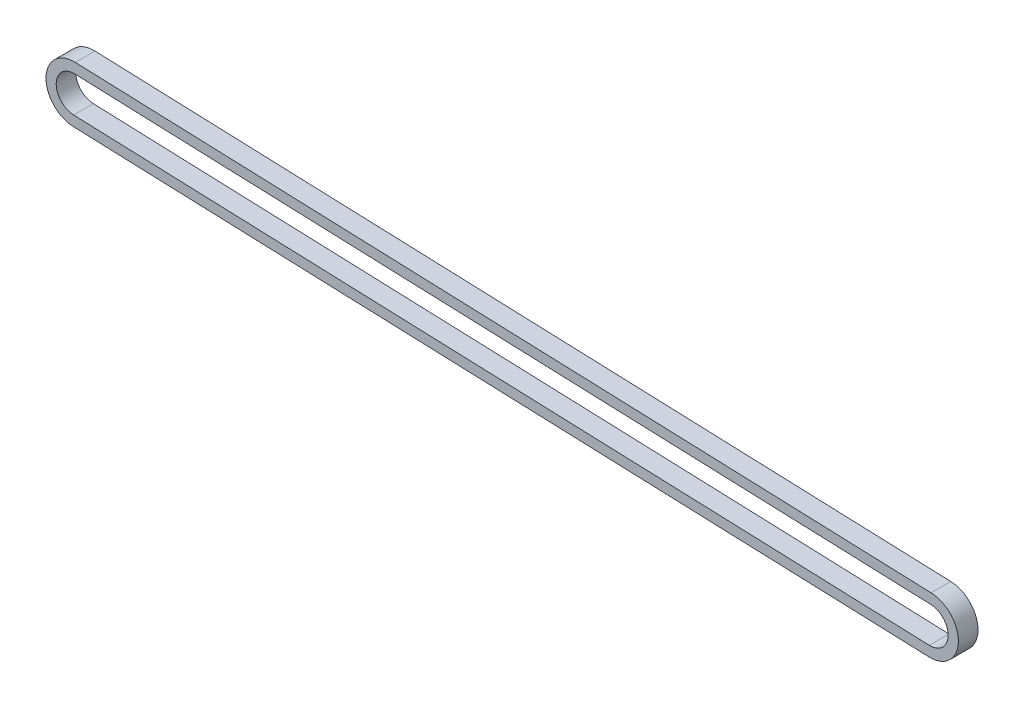
ISO-10303-21;
HEADER;
FILE_DESCRIPTION(('STEP AP214'),'2;1');
FILE_NAME('part.step','',(''),(''),'','','');
FILE_SCHEMA(('AUTOMOTIVE_DESIGN { 1 0 10303 214 1 1 1 1 }'));
ENDSEC;
DATA;
#1=APPLICATION_CONTEXT('core data for automotive mechanical design processes');
#2=APPLICATION_PROTOCOL_DEFINITION('international standard','automotive_design',2000,#1);
#3=PRODUCT_CONTEXT('',#1,'mechanical');
#4=PRODUCT('Part','Part','',(#3));
#5=PRODUCT_RELATED_PRODUCT_CATEGORY('part','',(#4));
#6=PRODUCT_DEFINITION_FORMATION('','',#4);
#7=PRODUCT_DEFINITION_CONTEXT('part definition',#1,'design');
#8=PRODUCT_DEFINITION('design','',#6,#7);
#9=PRODUCT_DEFINITION_SHAPE('','',#8);
#10=(LENGTH_UNIT() NAMED_UNIT(*) SI_UNIT(.MILLI.,.METRE.));
#11=(NAMED_UNIT(*) PLANE_ANGLE_UNIT() SI_UNIT($,.RADIAN.));
#12=(NAMED_UNIT(*) SI_UNIT($,.STERADIAN.) SOLID_ANGLE_UNIT());
#13=UNCERTAINTY_MEASURE_WITH_UNIT(LENGTH_MEASURE(1.E-05),#10,'distance_accuracy_value','');
#14=(GEOMETRIC_REPRESENTATION_CONTEXT(3) GLOBAL_UNCERTAINTY_ASSIGNED_CONTEXT((#13)) GLOBAL_UNIT_ASSIGNED_CONTEXT((#10,
#11,#12)) REPRESENTATION_CONTEXT('',''));
#15=CARTESIAN_POINT('',(0.,0.,0.));
#16=DIRECTION('',(0.,0.,1.));
#17=DIRECTION('',(1.,0.,0.));
#18=AXIS2_PLACEMENT_3D('',#15,#16,#17);
#19=CARTESIAN_POINT('',(0.,0.,3.175));
#20=DIRECTION('',(0.,0.,1.));
#21=DIRECTION('',(1.,0.,0.));
#22=AXIS2_PLACEMENT_3D('',#19,#20,#21);
#23=PLANE('',#22);
#24=CARTESIAN_POINT('',(0.,0.,3.175));
#25=DIRECTION('',(0.,0.,1.));
#26=DIRECTION('',(1.,0.,0.));
#27=AXIS2_PLACEMENT_3D('',#24,#25,#26);
#28=CIRCLE('',#27,4.572);
#29=CARTESIAN_POINT('',(-0.167974752628622,-4.56891327149896,3.175));
#30=VERTEX_POINT('',#29);
#31=CARTESIAN_POINT('',(0.167974752628638,4.56891327149896,3.175));
#32=VERTEX_POINT('',#31);
#33=EDGE_CURVE('E153',#30,#32,#28,.T.);
#34=ORIENTED_EDGE('',*,*,#33,.T.);
#35=DIRECTION('',(-0.999324862532581,0.0367398846519331,0.));
#36=VECTOR('',#35,1.);
#37=CARTESIAN_POINT('',(0.167974752628638,4.56891327149896,3.175));
#38=LINE('',#37,#36);
#39=CARTESIAN_POINT('',(-138.008025247371,9.64891327149896,3.175));
#40=VERTEX_POINT('',#39);
#41=EDGE_CURVE('E157',#32,#40,#38,.T.);
#42=ORIENTED_EDGE('',*,*,#41,.T.);
#43=CARTESIAN_POINT('',(-138.176,5.08,3.175));
#44=DIRECTION('',(0.,0.,1.));
#45=DIRECTION('',(1.,0.,0.));
#46=AXIS2_PLACEMENT_3D('',#43,#44,#45);
#47=CIRCLE('',#46,4.572);
#48=CARTESIAN_POINT('',(-138.343974752629,0.511086728501041,3.175));
#49=VERTEX_POINT('',#48);
#50=EDGE_CURVE('E161',#40,#49,#47,.T.);
#51=ORIENTED_EDGE('',*,*,#50,.T.);
#52=DIRECTION('',(0.999324862532581,-0.0367398846519331,0.));
#53=VECTOR('',#52,1.);
#54=CARTESIAN_POINT('',(-138.343974752629,0.51108672850104,3.175));
#55=LINE('',#54,#53);
#56=EDGE_CURVE('E164',#49,#30,#55,.T.);
#57=ORIENTED_EDGE('',*,*,#56,.T.);
#58=EDGE_LOOP('',(#34,#42,#51,#57));
#59=FACE_BOUND('',#58,.T.);
#60=DIRECTION('',(0.999324862532581,-0.0367398846519331,0.));
#61=VECTOR('',#60,1.);
#62=CARTESIAN_POINT('',(-138.283317203068,2.16097207654233,3.175));
#63=LINE('',#62,#61);
#64=CARTESIAN_POINT('',(-138.283317203068,2.16097207654233,3.175));
#65=VERTEX_POINT('',#64);
#66=CARTESIAN_POINT('',(-0.107317203068297,-2.91902792345767,3.175));
#67=VERTEX_POINT('',#66);
#68=EDGE_CURVE('E114',#65,#67,#63,.T.);
#69=ORIENTED_EDGE('',*,*,#68,.F.);
#70=CARTESIAN_POINT('',(-138.176,5.08,3.175));
#71=DIRECTION('',(0.,0.,1.));
#72=DIRECTION('',(1.,0.,0.));
#73=AXIS2_PLACEMENT_3D('',#70,#71,#72);
#74=CIRCLE('',#73,2.921);
#75=CARTESIAN_POINT('',(-138.068682796932,7.99902792345767,3.175));
#76=VERTEX_POINT('',#75);
#77=EDGE_CURVE('E105',#76,#65,#74,.T.);
#78=ORIENTED_EDGE('',*,*,#77,.F.);
#79=DIRECTION('',(-0.999324862532581,0.0367398846519331,0.));
#80=VECTOR('',#79,1.);
#81=CARTESIAN_POINT('',(0.107317203068297,2.91902792345767,3.175));
#82=LINE('',#81,#80);
#83=CARTESIAN_POINT('',(0.107317203068297,2.91902792345767,3.175));
#84=VERTEX_POINT('',#83);
#85=EDGE_CURVE('E131',#84,#76,#82,.T.);
#86=ORIENTED_EDGE('',*,*,#85,.F.);
#87=CARTESIAN_POINT('',(0.,0.,3.175));
#88=DIRECTION('',(0.,0.,1.));
#89=DIRECTION('',(1.,0.,0.));
#90=AXIS2_PLACEMENT_3D('',#87,#88,#89);
#91=CIRCLE('',#90,2.921);
#92=EDGE_CURVE('E127',#67,#84,#91,.T.);
#93=ORIENTED_EDGE('',*,*,#92,.F.);
#94=EDGE_LOOP('',(#69,#78,#86,#93));
#95=FACE_BOUND('',#94,.T.);
#96=ADVANCED_FACE('F39',(#59,#95),#23,.T.);
#97=CARTESIAN_POINT('',(0.,0.,0.));
#98=DIRECTION('',(0.,0.,1.));
#99=DIRECTION('',(1.,0.,0.));
#100=AXIS2_PLACEMENT_3D('',#97,#98,#99);
#101=PLANE('',#100);
#102=CARTESIAN_POINT('',(0.,0.,0.));
#103=DIRECTION('',(0.,0.,1.));
#104=DIRECTION('',(1.,0.,0.));
#105=AXIS2_PLACEMENT_3D('',#102,#103,#104);
#106=CIRCLE('',#105,4.572);
#107=CARTESIAN_POINT('',(-0.167974752628622,-4.56891327149896,0.));
#108=VERTEX_POINT('',#107);
#109=CARTESIAN_POINT('',(0.167974752628638,4.56891327149896,0.));
#110=VERTEX_POINT('',#109);
#111=EDGE_CURVE('E123',#108,#110,#106,.T.);
#112=ORIENTED_EDGE('',*,*,#111,.F.);
#113=DIRECTION('',(0.999324862532581,-0.0367398846519331,0.));
#114=VECTOR('',#113,1.);
#115=CARTESIAN_POINT('',(-138.343974752629,0.51108672850104,0.));
#116=LINE('',#115,#114);
#117=CARTESIAN_POINT('',(-138.343974752629,0.511086728501041,0.));
#118=VERTEX_POINT('',#117);
#119=EDGE_CURVE('E158',#118,#108,#116,.T.);
#120=ORIENTED_EDGE('',*,*,#119,.F.);
#121=CARTESIAN_POINT('',(-138.176,5.08,0.));
#122=DIRECTION('',(0.,0.,1.));
#123=DIRECTION('',(1.,0.,0.));
#124=AXIS2_PLACEMENT_3D('',#121,#122,#123);
#125=CIRCLE('',#124,4.572);
#126=CARTESIAN_POINT('',(-138.008025247371,9.64891327149896,0.));
#127=VERTEX_POINT('',#126);
#128=EDGE_CURVE('E174',#127,#118,#125,.T.);
#129=ORIENTED_EDGE('',*,*,#128,.F.);
#130=DIRECTION('',(-0.999324862532581,0.0367398846519331,0.));
#131=VECTOR('',#130,1.);
#132=CARTESIAN_POINT('',(0.167974752628638,4.56891327149896,0.));
#133=LINE('',#132,#131);
#134=EDGE_CURVE('E171',#110,#127,#133,.T.);
#135=ORIENTED_EDGE('',*,*,#134,.F.);
#136=EDGE_LOOP('',(#112,#120,#129,#135));
#137=FACE_BOUND('',#136,.T.);
#138=CARTESIAN_POINT('',(-138.176,5.08,0.));
#139=DIRECTION('',(0.,0.,1.));
#140=DIRECTION('',(1.,0.,0.));
#141=AXIS2_PLACEMENT_3D('',#138,#139,#140);
#142=CIRCLE('',#141,2.921);
#143=CARTESIAN_POINT('',(-138.068682796932,7.99902792345767,0.));
#144=VERTEX_POINT('',#143);
#145=CARTESIAN_POINT('',(-138.283317203068,2.16097207654233,0.));
#146=VERTEX_POINT('',#145);
#147=EDGE_CURVE('E63',#144,#146,#142,.T.);
#148=ORIENTED_EDGE('',*,*,#147,.T.);
#149=DIRECTION('',(0.999324862532581,-0.0367398846519331,0.));
#150=VECTOR('',#149,1.);
#151=CARTESIAN_POINT('',(-138.283317203068,2.16097207654233,0.));
#152=LINE('',#151,#150);
#153=CARTESIAN_POINT('',(-0.107317203068297,-2.91902792345767,0.));
#154=VERTEX_POINT('',#153);
#155=EDGE_CURVE('E121',#146,#154,#152,.T.);
#156=ORIENTED_EDGE('',*,*,#155,.T.);
#157=CARTESIAN_POINT('',(0.,0.,0.));
#158=DIRECTION('',(0.,0.,1.));
#159=DIRECTION('',(1.,0.,0.));
#160=AXIS2_PLACEMENT_3D('',#157,#158,#159);
#161=CIRCLE('',#160,2.921);
#162=CARTESIAN_POINT('',(0.107317203068297,2.91902792345767,0.));
#163=VERTEX_POINT('',#162);
#164=EDGE_CURVE('E140',#154,#163,#161,.T.);
#165=ORIENTED_EDGE('',*,*,#164,.T.);
#166=DIRECTION('',(-0.999324862532581,0.0367398846519331,0.));
#167=VECTOR('',#166,1.);
#168=CARTESIAN_POINT('',(0.107317203068297,2.91902792345767,0.));
#169=LINE('',#168,#167);
#170=EDGE_CURVE('E115',#163,#144,#169,.T.);
#171=ORIENTED_EDGE('',*,*,#170,.T.);
#172=EDGE_LOOP('',(#148,#156,#165,#171));
#173=FACE_BOUND('',#172,.T.);
#174=ADVANCED_FACE('F197',(#137,#173),#101,.F.);
#175=CARTESIAN_POINT('',(0.,0.,3.175));
#176=DIRECTION('',(0.,0.,-1.));
#177=DIRECTION('',(-1.,0.,0.));
#178=AXIS2_PLACEMENT_3D('',#175,#176,#177);
#179=CYLINDRICAL_SURFACE('',#178,4.572);
#180=ORIENTED_EDGE('',*,*,#111,.T.);
#181=DIRECTION('',(0.,0.,-1.));
#182=VECTOR('',#181,1.);
#183=CARTESIAN_POINT('',(0.167974752628638,4.56891327149896,3.175));
#184=LINE('',#183,#182);
#185=EDGE_CURVE('E11',#32,#110,#184,.T.);
#186=ORIENTED_EDGE('',*,*,#185,.F.);
#187=ORIENTED_EDGE('',*,*,#33,.F.);
#188=DIRECTION('',(0.,0.,-1.));
#189=VECTOR('',#188,1.);
#190=CARTESIAN_POINT('',(-0.167974752628622,-4.56891327149896,3.175));
#191=LINE('',#190,#189);
#192=EDGE_CURVE('E167',#30,#108,#191,.T.);
#193=ORIENTED_EDGE('',*,*,#192,.T.);
#194=EDGE_LOOP('',(#180,#186,#187,#193));
#195=FACE_BOUND('',#194,.T.);
#196=ADVANCED_FACE('F41',(#195),#179,.T.);
#197=CARTESIAN_POINT('',(0.167974752628638,4.56891327149896,3.175));
#198=DIRECTION('',(-0.0367398846519331,-0.999324862532581,0.));
#199=DIRECTION('',(0.999324862532581,-0.0367398846519331,0.));
#200=AXIS2_PLACEMENT_3D('',#197,#198,#199);
#201=PLANE('',#200);
#202=ORIENTED_EDGE('',*,*,#134,.T.);
#203=DIRECTION('',(0.,0.,-1.));
#204=VECTOR('',#203,1.);
#205=CARTESIAN_POINT('',(-138.008025247371,9.64891327149896,3.175));
#206=LINE('',#205,#204);
#207=EDGE_CURVE('E48',#40,#127,#206,.T.);
#208=ORIENTED_EDGE('',*,*,#207,.F.);
#209=ORIENTED_EDGE('',*,*,#41,.F.);
#210=ORIENTED_EDGE('',*,*,#185,.T.);
#211=EDGE_LOOP('',(#202,#208,#209,#210));
#212=FACE_BOUND('',#211,.T.);
#213=ADVANCED_FACE('F207',(#212),#201,.F.);
#214=CARTESIAN_POINT('',(-138.176,5.08,3.175));
#215=DIRECTION('',(0.,0.,-1.));
#216=DIRECTION('',(-1.,0.,0.));
#217=AXIS2_PLACEMENT_3D('',#214,#215,#216);
#218=CYLINDRICAL_SURFACE('',#217,4.572);
#219=ORIENTED_EDGE('',*,*,#128,.T.);
#220=DIRECTION('',(0.,0.,-1.));
#221=VECTOR('',#220,1.);
#222=CARTESIAN_POINT('',(-138.343974752629,0.511086728501041,3.175));
#223=LINE('',#222,#221);
#224=EDGE_CURVE('E182',#49,#118,#223,.T.);
#225=ORIENTED_EDGE('',*,*,#224,.F.);
#226=ORIENTED_EDGE('',*,*,#50,.F.);
#227=ORIENTED_EDGE('',*,*,#207,.T.);
#228=EDGE_LOOP('',(#219,#225,#226,#227));
#229=FACE_BOUND('',#228,.T.);
#230=ADVANCED_FACE('F191',(#229),#218,.T.);
#231=CARTESIAN_POINT('',(-138.343974752629,0.51108672850104,3.175));
#232=DIRECTION('',(0.0367398846519331,0.999324862532581,0.));
#233=DIRECTION('',(-0.999324862532581,0.0367398846519331,0.));
#234=AXIS2_PLACEMENT_3D('',#231,#232,#233);
#235=PLANE('',#234);
#236=ORIENTED_EDGE('',*,*,#119,.T.);
#237=ORIENTED_EDGE('',*,*,#192,.F.);
#238=ORIENTED_EDGE('',*,*,#56,.F.);
#239=ORIENTED_EDGE('',*,*,#224,.T.);
#240=EDGE_LOOP('',(#236,#237,#238,#239));
#241=FACE_BOUND('',#240,.T.);
#242=ADVANCED_FACE('F201',(#241),#235,.F.);
#243=CARTESIAN_POINT('',(-138.176,5.08,3.175));
#244=DIRECTION('',(0.,0.,-1.));
#245=DIRECTION('',(-1.,0.,0.));
#246=AXIS2_PLACEMENT_3D('',#243,#244,#245);
#247=CYLINDRICAL_SURFACE('',#246,2.921);
#248=ORIENTED_EDGE('',*,*,#147,.F.);
#249=DIRECTION('',(0.,0.,-1.));
#250=VECTOR('',#249,1.);
#251=CARTESIAN_POINT('',(-138.068682796932,7.99902792345767,3.175));
#252=LINE('',#251,#250);
#253=EDGE_CURVE('E109',#76,#144,#252,.T.);
#254=ORIENTED_EDGE('',*,*,#253,.F.);
#255=ORIENTED_EDGE('',*,*,#77,.T.);
#256=DIRECTION('',(0.,0.,-1.));
#257=VECTOR('',#256,1.);
#258=CARTESIAN_POINT('',(-138.283317203068,2.16097207654233,3.175));
#259=LINE('',#258,#257);
#260=EDGE_CURVE('E108',#65,#146,#259,.T.);
#261=ORIENTED_EDGE('',*,*,#260,.T.);
#262=EDGE_LOOP('',(#248,#254,#255,#261));
#263=FACE_BOUND('',#262,.T.);
#264=ADVANCED_FACE('F107',(#263),#247,.F.);
#265=CARTESIAN_POINT('',(-138.283317203068,2.16097207654233,3.175));
#266=DIRECTION('',(0.0367398846519331,0.999324862532581,0.));
#267=DIRECTION('',(-0.999324862532581,0.0367398846519331,0.));
#268=AXIS2_PLACEMENT_3D('',#265,#266,#267);
#269=PLANE('',#268);
#270=ORIENTED_EDGE('',*,*,#155,.F.);
#271=ORIENTED_EDGE('',*,*,#260,.F.);
#272=ORIENTED_EDGE('',*,*,#68,.T.);
#273=DIRECTION('',(0.,0.,-1.));
#274=VECTOR('',#273,1.);
#275=CARTESIAN_POINT('',(-0.107317203068297,-2.91902792345767,3.175));
#276=LINE('',#275,#274);
#277=EDGE_CURVE('E124',#67,#154,#276,.T.);
#278=ORIENTED_EDGE('',*,*,#277,.T.);
#279=EDGE_LOOP('',(#270,#271,#272,#278));
#280=FACE_BOUND('',#279,.T.);
#281=ADVANCED_FACE('F118',(#280),#269,.T.);
#282=CARTESIAN_POINT('',(0.,0.,3.175));
#283=DIRECTION('',(0.,0.,-1.));
#284=DIRECTION('',(-1.,0.,0.));
#285=AXIS2_PLACEMENT_3D('',#282,#283,#284);
#286=CYLINDRICAL_SURFACE('',#285,2.921);
#287=ORIENTED_EDGE('',*,*,#164,.F.);
#288=ORIENTED_EDGE('',*,*,#277,.F.);
#289=ORIENTED_EDGE('',*,*,#92,.T.);
#290=DIRECTION('',(0.,0.,-1.));
#291=VECTOR('',#290,1.);
#292=CARTESIAN_POINT('',(0.107317203068297,2.91902792345767,3.175));
#293=LINE('',#292,#291);
#294=EDGE_CURVE('E55',#84,#163,#293,.T.);
#295=ORIENTED_EDGE('',*,*,#294,.T.);
#296=EDGE_LOOP('',(#287,#288,#289,#295));
#297=FACE_BOUND('',#296,.T.);
#298=ADVANCED_FACE('F230',(#297),#286,.F.);
#299=CARTESIAN_POINT('',(0.107317203068297,2.91902792345767,3.175));
#300=DIRECTION('',(-0.0367398846519331,-0.999324862532581,0.));
#301=DIRECTION('',(0.999324862532581,-0.0367398846519331,0.));
#302=AXIS2_PLACEMENT_3D('',#299,#300,#301);
#303=PLANE('',#302);
#304=ORIENTED_EDGE('',*,*,#170,.F.);
#305=ORIENTED_EDGE('',*,*,#294,.F.);
#306=ORIENTED_EDGE('',*,*,#85,.T.);
#307=ORIENTED_EDGE('',*,*,#253,.T.);
#308=EDGE_LOOP('',(#304,#305,#306,#307));
#309=FACE_BOUND('',#308,.T.);
#310=ADVANCED_FACE('F234',(#309),#303,.T.);
#311=CLOSED_SHELL('',(#96,#174,#196,#213,#230,#242,#264,#281,#298,#310));
#312=MANIFOLD_SOLID_BREP('B2',#311);
#313=ADVANCED_BREP_SHAPE_REPRESENTATION('',(#18,#312),#14);
#314=SHAPE_DEFINITION_REPRESENTATION(#9,#313);
ENDSEC;
END-ISO-10303-21;
